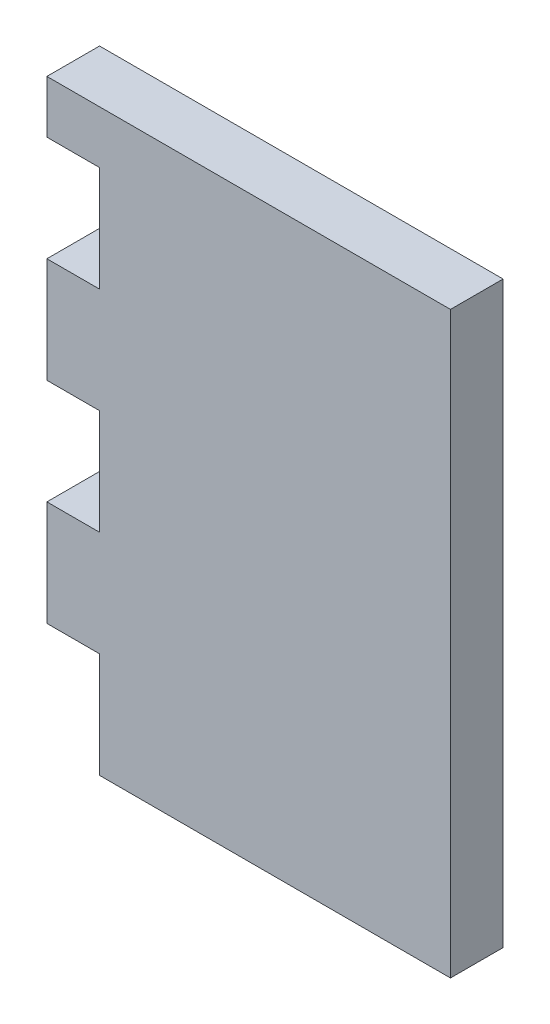
ISO-10303-21;
HEADER;
FILE_DESCRIPTION(('STEP AP214'),'2;1');
FILE_NAME('part.step','',(''),(''),'','','');
FILE_SCHEMA(('AUTOMOTIVE_DESIGN { 1 0 10303 214 1 1 1 1 }'));
ENDSEC;
DATA;
#1=APPLICATION_CONTEXT('core data for automotive mechanical design processes');
#2=APPLICATION_PROTOCOL_DEFINITION('international standard','automotive_design',2000,#1);
#3=PRODUCT_CONTEXT('',#1,'mechanical');
#4=PRODUCT('Part','Part','',(#3));
#5=PRODUCT_RELATED_PRODUCT_CATEGORY('part','',(#4));
#6=PRODUCT_DEFINITION_FORMATION('','',#4);
#7=PRODUCT_DEFINITION_CONTEXT('part definition',#1,'design');
#8=PRODUCT_DEFINITION('design','',#6,#7);
#9=PRODUCT_DEFINITION_SHAPE('','',#8);
#10=(LENGTH_UNIT() NAMED_UNIT(*) SI_UNIT(.MILLI.,.METRE.));
#11=(NAMED_UNIT(*) PLANE_ANGLE_UNIT() SI_UNIT($,.RADIAN.));
#12=(NAMED_UNIT(*) SI_UNIT($,.STERADIAN.) SOLID_ANGLE_UNIT());
#13=UNCERTAINTY_MEASURE_WITH_UNIT(LENGTH_MEASURE(1.E-05),#10,'distance_accuracy_value','');
#14=(GEOMETRIC_REPRESENTATION_CONTEXT(3) GLOBAL_UNCERTAINTY_ASSIGNED_CONTEXT((#13)) GLOBAL_UNIT_ASSIGNED_CONTEXT((#10,
#11,#12)) REPRESENTATION_CONTEXT('',''));
#15=CARTESIAN_POINT('',(0.,0.,0.));
#16=DIRECTION('',(0.,0.,1.));
#17=DIRECTION('',(1.,0.,0.));
#18=AXIS2_PLACEMENT_3D('',#15,#16,#17);
#19=CARTESIAN_POINT('',(0.,0.,6.));
#20=DIRECTION('',(1.,0.,0.));
#21=DIRECTION('',(0.,0.,-1.));
#22=AXIS2_PLACEMENT_3D('',#19,#20,#21);
#23=PLANE('',#22);
#24=DIRECTION('',(0.,-1.,0.));
#25=VECTOR('',#24,1.);
#26=CARTESIAN_POINT('',(0.,0.,0.));
#27=LINE('',#26,#25);
#28=CARTESIAN_POINT('',(0.,0.,0.));
#29=VERTEX_POINT('',#28);
#30=CARTESIAN_POINT('',(0.,-6.00000000000001,0.));
#31=VERTEX_POINT('',#30);
#32=EDGE_CURVE('E179',#29,#31,#27,.T.);
#33=ORIENTED_EDGE('',*,*,#32,.T.);
#34=DIRECTION('',(0.,0.,-1.));
#35=VECTOR('',#34,1.);
#36=CARTESIAN_POINT('',(0.,-6.00000000000001,6.));
#37=LINE('',#36,#35);
#38=CARTESIAN_POINT('',(0.,-6.00000000000001,6.));
#39=VERTEX_POINT('',#38);
#40=EDGE_CURVE('E11',#39,#31,#37,.T.);
#41=ORIENTED_EDGE('',*,*,#40,.F.);
#42=DIRECTION('',(0.,-1.,0.));
#43=VECTOR('',#42,1.);
#44=CARTESIAN_POINT('',(0.,0.,6.));
#45=LINE('',#44,#43);
#46=CARTESIAN_POINT('',(0.,0.,6.));
#47=VERTEX_POINT('',#46);
#48=EDGE_CURVE('E225',#47,#39,#45,.T.);
#49=ORIENTED_EDGE('',*,*,#48,.F.);
#50=DIRECTION('',(0.,0.,-1.));
#51=VECTOR('',#50,1.);
#52=CARTESIAN_POINT('',(0.,0.,6.));
#53=LINE('',#52,#51);
#54=EDGE_CURVE('E59',#47,#29,#53,.T.);
#55=ORIENTED_EDGE('',*,*,#54,.T.);
#56=EDGE_LOOP('',(#33,#41,#49,#55));
#57=FACE_BOUND('',#56,.T.);
#58=ADVANCED_FACE('F41',(#57),#23,.F.);
#59=CARTESIAN_POINT('',(0.,-6.00000000000001,6.));
#60=DIRECTION('',(0.,1.,0.));
#61=DIRECTION('',(0.,0.,1.));
#62=AXIS2_PLACEMENT_3D('',#59,#60,#61);
#63=PLANE('',#62);
#64=DIRECTION('',(1.,0.,0.));
#65=VECTOR('',#64,1.);
#66=CARTESIAN_POINT('',(0.,-6.00000000000001,0.));
#67=LINE('',#66,#65);
#68=CARTESIAN_POINT('',(5.99999999999984,-6.00000000000001,0.));
#69=VERTEX_POINT('',#68);
#70=EDGE_CURVE('E182',#31,#69,#67,.T.);
#71=ORIENTED_EDGE('',*,*,#70,.T.);
#72=DIRECTION('',(0.,0.,-1.));
#73=VECTOR('',#72,1.);
#74=CARTESIAN_POINT('',(5.99999999999984,-6.00000000000001,6.));
#75=LINE('',#74,#73);
#76=CARTESIAN_POINT('',(5.99999999999984,-6.00000000000001,6.));
#77=VERTEX_POINT('',#76);
#78=EDGE_CURVE('E51',#77,#69,#75,.T.);
#79=ORIENTED_EDGE('',*,*,#78,.F.);
#80=DIRECTION('',(1.,0.,0.));
#81=VECTOR('',#80,1.);
#82=CARTESIAN_POINT('',(0.,-6.00000000000001,6.));
#83=LINE('',#82,#81);
#84=EDGE_CURVE('E115',#39,#77,#83,.T.);
#85=ORIENTED_EDGE('',*,*,#84,.F.);
#86=ORIENTED_EDGE('',*,*,#40,.T.);
#87=EDGE_LOOP('',(#71,#79,#85,#86));
#88=FACE_BOUND('',#87,.T.);
#89=ADVANCED_FACE('F43',(#88),#63,.F.);
#90=CARTESIAN_POINT('',(5.99999999999984,0.,6.));
#91=DIRECTION('',(-1.,0.,0.));
#92=DIRECTION('',(0.,-1.,0.));
#93=AXIS2_PLACEMENT_3D('',#90,#91,#92);
#94=PLANE('',#93);
#95=DIRECTION('',(0.,1.,0.));
#96=VECTOR('',#95,1.);
#97=CARTESIAN_POINT('',(5.99999999999984,0.,0.));
#98=LINE('',#97,#96);
#99=CARTESIAN_POINT('',(5.99999999999984,-18.,0.));
#100=VERTEX_POINT('',#99);
#101=EDGE_CURVE('E188',#100,#69,#98,.T.);
#102=ORIENTED_EDGE('',*,*,#101,.F.);
#103=DIRECTION('',(0.,0.,-1.));
#104=VECTOR('',#103,1.);
#105=CARTESIAN_POINT('',(5.99999999999984,-18.,6.));
#106=LINE('',#105,#104);
#107=CARTESIAN_POINT('',(5.99999999999984,-18.,6.));
#108=VERTEX_POINT('',#107);
#109=EDGE_CURVE('E255',#108,#100,#106,.T.);
#110=ORIENTED_EDGE('',*,*,#109,.F.);
#111=DIRECTION('',(0.,1.,0.));
#112=VECTOR('',#111,1.);
#113=CARTESIAN_POINT('',(5.99999999999984,0.,6.));
#114=LINE('',#113,#112);
#115=EDGE_CURVE('E263',#108,#77,#114,.T.);
#116=ORIENTED_EDGE('',*,*,#115,.T.);
#117=ORIENTED_EDGE('',*,*,#78,.T.);
#118=EDGE_LOOP('',(#102,#110,#116,#117));
#119=FACE_BOUND('',#118,.T.);
#120=ADVANCED_FACE('F261',(#119),#94,.T.);
#121=CARTESIAN_POINT('',(0.,-18.,6.));
#122=DIRECTION('',(0.,1.,0.));
#123=DIRECTION('',(0.,0.,1.));
#124=AXIS2_PLACEMENT_3D('',#121,#122,#123);
#125=PLANE('',#124);
#126=DIRECTION('',(1.,0.,0.));
#127=VECTOR('',#126,1.);
#128=CARTESIAN_POINT('',(0.,-18.,0.));
#129=LINE('',#128,#127);
#130=CARTESIAN_POINT('',(0.,-18.,0.));
#131=VERTEX_POINT('',#130);
#132=EDGE_CURVE('E192',#131,#100,#129,.T.);
#133=ORIENTED_EDGE('',*,*,#132,.F.);
#134=DIRECTION('',(0.,0.,-1.));
#135=VECTOR('',#134,1.);
#136=CARTESIAN_POINT('',(0.,-18.,6.));
#137=LINE('',#136,#135);
#138=CARTESIAN_POINT('',(0.,-18.,6.));
#139=VERTEX_POINT('',#138);
#140=EDGE_CURVE('E252',#139,#131,#137,.T.);
#141=ORIENTED_EDGE('',*,*,#140,.F.);
#142=DIRECTION('',(1.,0.,0.));
#143=VECTOR('',#142,1.);
#144=CARTESIAN_POINT('',(0.,-18.,6.));
#145=LINE('',#144,#143);
#146=EDGE_CURVE('E275',#139,#108,#145,.T.);
#147=ORIENTED_EDGE('',*,*,#146,.T.);
#148=ORIENTED_EDGE('',*,*,#109,.T.);
#149=EDGE_LOOP('',(#133,#141,#147,#148));
#150=FACE_BOUND('',#149,.T.);
#151=ADVANCED_FACE('F271',(#150),#125,.T.);
#152=CARTESIAN_POINT('',(0.,-30.,0.));
#153=VERTEX_POINT('',#152);
#154=EDGE_CURVE('E184',#131,#153,#27,.T.);
#155=ORIENTED_EDGE('',*,*,#154,.T.);
#156=DIRECTION('',(0.,0.,-1.));
#157=VECTOR('',#156,1.);
#158=CARTESIAN_POINT('',(0.,-30.,6.));
#159=LINE('',#158,#157);
#160=CARTESIAN_POINT('',(0.,-30.,6.));
#161=VERTEX_POINT('',#160);
#162=EDGE_CURVE('E248',#161,#153,#159,.T.);
#163=ORIENTED_EDGE('',*,*,#162,.F.);
#164=EDGE_CURVE('E280',#139,#161,#45,.T.);
#165=ORIENTED_EDGE('',*,*,#164,.F.);
#166=ORIENTED_EDGE('',*,*,#140,.T.);
#167=EDGE_LOOP('',(#155,#163,#165,#166));
#168=FACE_BOUND('',#167,.T.);
#169=ADVANCED_FACE('F317',(#168),#23,.F.);
#170=CARTESIAN_POINT('',(0.,-30.,6.));
#171=DIRECTION('',(0.,1.,0.));
#172=DIRECTION('',(0.,0.,1.));
#173=AXIS2_PLACEMENT_3D('',#170,#171,#172);
#174=PLANE('',#173);
#175=DIRECTION('',(1.,0.,0.));
#176=VECTOR('',#175,1.);
#177=CARTESIAN_POINT('',(0.,-30.,0.));
#178=LINE('',#177,#176);
#179=CARTESIAN_POINT('',(5.99999999999993,-30.,0.));
#180=VERTEX_POINT('',#179);
#181=EDGE_CURVE('E196',#153,#180,#178,.T.);
#182=ORIENTED_EDGE('',*,*,#181,.T.);
#183=DIRECTION('',(0.,0.,-1.));
#184=VECTOR('',#183,1.);
#185=CARTESIAN_POINT('',(5.99999999999993,-30.,6.));
#186=LINE('',#185,#184);
#187=CARTESIAN_POINT('',(5.99999999999993,-30.,6.));
#188=VERTEX_POINT('',#187);
#189=EDGE_CURVE('E245',#188,#180,#186,.T.);
#190=ORIENTED_EDGE('',*,*,#189,.F.);
#191=DIRECTION('',(1.,0.,0.));
#192=VECTOR('',#191,1.);
#193=CARTESIAN_POINT('',(0.,-30.,6.));
#194=LINE('',#193,#192);
#195=EDGE_CURVE('E285',#161,#188,#194,.T.);
#196=ORIENTED_EDGE('',*,*,#195,.F.);
#197=ORIENTED_EDGE('',*,*,#162,.T.);
#198=EDGE_LOOP('',(#182,#190,#196,#197));
#199=FACE_BOUND('',#198,.T.);
#200=ADVANCED_FACE('F325',(#199),#174,.F.);
#201=CARTESIAN_POINT('',(5.99999999999993,0.,6.));
#202=DIRECTION('',(-1.,0.,0.));
#203=DIRECTION('',(0.,-1.,0.));
#204=AXIS2_PLACEMENT_3D('',#201,#202,#203);
#205=PLANE('',#204);
#206=DIRECTION('',(0.,1.,0.));
#207=VECTOR('',#206,1.);
#208=CARTESIAN_POINT('',(5.99999999999993,0.,0.));
#209=LINE('',#208,#207);
#210=CARTESIAN_POINT('',(5.99999999999992,-42.,0.));
#211=VERTEX_POINT('',#210);
#212=EDGE_CURVE('E200',#211,#180,#209,.T.);
#213=ORIENTED_EDGE('',*,*,#212,.F.);
#214=DIRECTION('',(0.,0.,-1.));
#215=VECTOR('',#214,1.);
#216=CARTESIAN_POINT('',(5.99999999999992,-42.,6.));
#217=LINE('',#216,#215);
#218=CARTESIAN_POINT('',(5.99999999999992,-42.,6.));
#219=VERTEX_POINT('',#218);
#220=EDGE_CURVE('E242',#219,#211,#217,.T.);
#221=ORIENTED_EDGE('',*,*,#220,.F.);
#222=DIRECTION('',(0.,1.,0.));
#223=VECTOR('',#222,1.);
#224=CARTESIAN_POINT('',(5.99999999999993,0.,6.));
#225=LINE('',#224,#223);
#226=EDGE_CURVE('E288',#219,#188,#225,.T.);
#227=ORIENTED_EDGE('',*,*,#226,.T.);
#228=ORIENTED_EDGE('',*,*,#189,.T.);
#229=EDGE_LOOP('',(#213,#221,#227,#228));
#230=FACE_BOUND('',#229,.T.);
#231=ADVANCED_FACE('F336',(#230),#205,.T.);
#232=CARTESIAN_POINT('',(0.,-42.,6.));
#233=DIRECTION('',(0.,1.,0.));
#234=DIRECTION('',(0.,0.,1.));
#235=AXIS2_PLACEMENT_3D('',#232,#233,#234);
#236=PLANE('',#235);
#237=DIRECTION('',(1.,0.,0.));
#238=VECTOR('',#237,1.);
#239=CARTESIAN_POINT('',(0.,-42.,0.));
#240=LINE('',#239,#238);
#241=CARTESIAN_POINT('',(0.,-42.,0.));
#242=VERTEX_POINT('',#241);
#243=EDGE_CURVE('E204',#242,#211,#240,.T.);
#244=ORIENTED_EDGE('',*,*,#243,.F.);
#245=DIRECTION('',(0.,0.,-1.));
#246=VECTOR('',#245,1.);
#247=CARTESIAN_POINT('',(0.,-42.,6.));
#248=LINE('',#247,#246);
#249=CARTESIAN_POINT('',(0.,-42.,6.));
#250=VERTEX_POINT('',#249);
#251=EDGE_CURVE('E239',#250,#242,#248,.T.);
#252=ORIENTED_EDGE('',*,*,#251,.F.);
#253=DIRECTION('',(1.,0.,0.));
#254=VECTOR('',#253,1.);
#255=CARTESIAN_POINT('',(0.,-42.,6.));
#256=LINE('',#255,#254);
#257=EDGE_CURVE('E292',#250,#219,#256,.T.);
#258=ORIENTED_EDGE('',*,*,#257,.T.);
#259=ORIENTED_EDGE('',*,*,#220,.T.);
#260=EDGE_LOOP('',(#244,#252,#258,#259));
#261=FACE_BOUND('',#260,.T.);
#262=ADVANCED_FACE('F329',(#261),#236,.T.);
#263=CARTESIAN_POINT('',(0.,-54.,0.));
#264=VERTEX_POINT('',#263);
#265=EDGE_CURVE('E183',#242,#264,#27,.T.);
#266=ORIENTED_EDGE('',*,*,#265,.T.);
#267=DIRECTION('',(0.,0.,-1.));
#268=VECTOR('',#267,1.);
#269=CARTESIAN_POINT('',(0.,-54.,6.));
#270=LINE('',#269,#268);
#271=CARTESIAN_POINT('',(0.,-54.,6.));
#272=VERTEX_POINT('',#271);
#273=EDGE_CURVE('E235',#272,#264,#270,.T.);
#274=ORIENTED_EDGE('',*,*,#273,.F.);
#275=EDGE_CURVE('E296',#250,#272,#45,.T.);
#276=ORIENTED_EDGE('',*,*,#275,.F.);
#277=ORIENTED_EDGE('',*,*,#251,.T.);
#278=EDGE_LOOP('',(#266,#274,#276,#277));
#279=FACE_BOUND('',#278,.T.);
#280=ADVANCED_FACE('F318',(#279),#23,.F.);
#281=CARTESIAN_POINT('',(0.,-54.,6.));
#282=DIRECTION('',(0.,1.,0.));
#283=DIRECTION('',(0.,0.,1.));
#284=AXIS2_PLACEMENT_3D('',#281,#282,#283);
#285=PLANE('',#284);
#286=DIRECTION('',(1.,0.,0.));
#287=VECTOR('',#286,1.);
#288=CARTESIAN_POINT('',(0.,-54.,0.));
#289=LINE('',#288,#287);
#290=CARTESIAN_POINT('',(6.00000000000001,-54.,0.));
#291=VERTEX_POINT('',#290);
#292=EDGE_CURVE('E208',#264,#291,#289,.T.);
#293=ORIENTED_EDGE('',*,*,#292,.T.);
#294=DIRECTION('',(0.,0.,-1.));
#295=VECTOR('',#294,1.);
#296=CARTESIAN_POINT('',(6.00000000000001,-54.,6.));
#297=LINE('',#296,#295);
#298=CARTESIAN_POINT('',(6.00000000000001,-54.,6.));
#299=VERTEX_POINT('',#298);
#300=EDGE_CURVE('E232',#299,#291,#297,.T.);
#301=ORIENTED_EDGE('',*,*,#300,.F.);
#302=DIRECTION('',(1.,0.,0.));
#303=VECTOR('',#302,1.);
#304=CARTESIAN_POINT('',(0.,-54.,6.));
#305=LINE('',#304,#303);
#306=EDGE_CURVE('E297',#272,#299,#305,.T.);
#307=ORIENTED_EDGE('',*,*,#306,.F.);
#308=ORIENTED_EDGE('',*,*,#273,.T.);
#309=EDGE_LOOP('',(#293,#301,#307,#308));
#310=FACE_BOUND('',#309,.T.);
#311=ADVANCED_FACE('F328',(#310),#285,.F.);
#312=CARTESIAN_POINT('',(6.00000000000002,0.,6.));
#313=DIRECTION('',(-1.,0.,0.));
#314=DIRECTION('',(0.,-1.,0.));
#315=AXIS2_PLACEMENT_3D('',#312,#313,#314);
#316=PLANE('',#315);
#317=DIRECTION('',(0.,1.,0.));
#318=VECTOR('',#317,1.);
#319=CARTESIAN_POINT('',(6.00000000000002,0.,0.));
#320=LINE('',#319,#318);
#321=CARTESIAN_POINT('',(6.00000000000001,-66.,0.));
#322=VERTEX_POINT('',#321);
#323=EDGE_CURVE('E212',#322,#291,#320,.T.);
#324=ORIENTED_EDGE('',*,*,#323,.F.);
#325=DIRECTION('',(0.,0.,-1.));
#326=VECTOR('',#325,1.);
#327=CARTESIAN_POINT('',(6.00000000000001,-66.,6.));
#328=LINE('',#327,#326);
#329=CARTESIAN_POINT('',(6.00000000000001,-66.,6.));
#330=VERTEX_POINT('',#329);
#331=EDGE_CURVE('E169',#330,#322,#328,.T.);
#332=ORIENTED_EDGE('',*,*,#331,.F.);
#333=DIRECTION('',(0.,1.,0.));
#334=VECTOR('',#333,1.);
#335=CARTESIAN_POINT('',(6.00000000000002,0.,6.));
#336=LINE('',#335,#334);
#337=EDGE_CURVE('E157',#330,#299,#336,.T.);
#338=ORIENTED_EDGE('',*,*,#337,.T.);
#339=ORIENTED_EDGE('',*,*,#300,.T.);
#340=EDGE_LOOP('',(#324,#332,#338,#339));
#341=FACE_BOUND('',#340,.T.);
#342=ADVANCED_FACE('F302',(#341),#316,.T.);
#343=CARTESIAN_POINT('',(0.,-66.,6.));
#344=DIRECTION('',(0.,1.,0.));
#345=DIRECTION('',(0.,0.,1.));
#346=AXIS2_PLACEMENT_3D('',#343,#344,#345);
#347=PLANE('',#346);
#348=DIRECTION('',(1.,0.,0.));
#349=VECTOR('',#348,1.);
#350=CARTESIAN_POINT('',(0.,-66.,0.));
#351=LINE('',#350,#349);
#352=CARTESIAN_POINT('',(46.,-66.,0.));
#353=VERTEX_POINT('',#352);
#354=EDGE_CURVE('E165',#322,#353,#351,.T.);
#355=ORIENTED_EDGE('',*,*,#354,.T.);
#356=DIRECTION('',(0.,0.,-1.));
#357=VECTOR('',#356,1.);
#358=CARTESIAN_POINT('',(46.,-66.,6.));
#359=LINE('',#358,#357);
#360=CARTESIAN_POINT('',(46.,-66.,6.));
#361=VERTEX_POINT('',#360);
#362=EDGE_CURVE('E162',#361,#353,#359,.T.);
#363=ORIENTED_EDGE('',*,*,#362,.F.);
#364=DIRECTION('',(1.,0.,0.));
#365=VECTOR('',#364,1.);
#366=CARTESIAN_POINT('',(0.,-66.,6.));
#367=LINE('',#366,#365);
#368=EDGE_CURVE('E150',#330,#361,#367,.T.);
#369=ORIENTED_EDGE('',*,*,#368,.F.);
#370=ORIENTED_EDGE('',*,*,#331,.T.);
#371=EDGE_LOOP('',(#355,#363,#369,#370));
#372=FACE_BOUND('',#371,.T.);
#373=ADVANCED_FACE('F163',(#372),#347,.F.);
#374=CARTESIAN_POINT('',(46.,0.,6.));
#375=DIRECTION('',(1.,0.,0.));
#376=DIRECTION('',(0.,0.,-1.));
#377=AXIS2_PLACEMENT_3D('',#374,#375,#376);
#378=PLANE('',#377);
#379=DIRECTION('',(0.,-1.,0.));
#380=VECTOR('',#379,1.);
#381=CARTESIAN_POINT('',(46.,0.,0.));
#382=LINE('',#381,#380);
#383=CARTESIAN_POINT('',(46.,0.,0.));
#384=VERTEX_POINT('',#383);
#385=EDGE_CURVE('E218',#384,#353,#382,.T.);
#386=ORIENTED_EDGE('',*,*,#385,.F.);
#387=DIRECTION('',(0.,0.,-1.));
#388=VECTOR('',#387,1.);
#389=CARTESIAN_POINT('',(46.,0.,6.));
#390=LINE('',#389,#388);
#391=CARTESIAN_POINT('',(46.,0.,6.));
#392=VERTEX_POINT('',#391);
#393=EDGE_CURVE('E103',#392,#384,#390,.T.);
#394=ORIENTED_EDGE('',*,*,#393,.F.);
#395=DIRECTION('',(0.,-1.,0.));
#396=VECTOR('',#395,1.);
#397=CARTESIAN_POINT('',(46.,0.,6.));
#398=LINE('',#397,#396);
#399=EDGE_CURVE('E155',#392,#361,#398,.T.);
#400=ORIENTED_EDGE('',*,*,#399,.T.);
#401=ORIENTED_EDGE('',*,*,#362,.T.);
#402=EDGE_LOOP('',(#386,#394,#400,#401));
#403=FACE_BOUND('',#402,.T.);
#404=ADVANCED_FACE('F171',(#403),#378,.T.);
#405=CARTESIAN_POINT('',(0.,0.,6.));
#406=DIRECTION('',(0.,1.,0.));
#407=DIRECTION('',(0.,0.,1.));
#408=AXIS2_PLACEMENT_3D('',#405,#406,#407);
#409=PLANE('',#408);
#410=DIRECTION('',(1.,0.,0.));
#411=VECTOR('',#410,1.);
#412=CARTESIAN_POINT('',(0.,0.,0.));
#413=LINE('',#412,#411);
#414=EDGE_CURVE('E221',#29,#384,#413,.T.);
#415=ORIENTED_EDGE('',*,*,#414,.F.);
#416=ORIENTED_EDGE('',*,*,#54,.F.);
#417=DIRECTION('',(1.,0.,0.));
#418=VECTOR('',#417,1.);
#419=CARTESIAN_POINT('',(0.,0.,6.));
#420=LINE('',#419,#418);
#421=EDGE_CURVE('E173',#47,#392,#420,.T.);
#422=ORIENTED_EDGE('',*,*,#421,.T.);
#423=ORIENTED_EDGE('',*,*,#393,.T.);
#424=EDGE_LOOP('',(#415,#416,#422,#423));
#425=FACE_BOUND('',#424,.T.);
#426=ADVANCED_FACE('F305',(#425),#409,.T.);
#427=CARTESIAN_POINT('',(0.,0.,6.));
#428=DIRECTION('',(0.,0.,1.));
#429=DIRECTION('',(1.,0.,0.));
#430=AXIS2_PLACEMENT_3D('',#427,#428,#429);
#431=PLANE('',#430);
#432=ORIENTED_EDGE('',*,*,#48,.T.);
#433=ORIENTED_EDGE('',*,*,#84,.T.);
#434=ORIENTED_EDGE('',*,*,#115,.F.);
#435=ORIENTED_EDGE('',*,*,#146,.F.);
#436=ORIENTED_EDGE('',*,*,#164,.T.);
#437=ORIENTED_EDGE('',*,*,#195,.T.);
#438=ORIENTED_EDGE('',*,*,#226,.F.);
#439=ORIENTED_EDGE('',*,*,#257,.F.);
#440=ORIENTED_EDGE('',*,*,#275,.T.);
#441=ORIENTED_EDGE('',*,*,#306,.T.);
#442=ORIENTED_EDGE('',*,*,#337,.F.);
#443=ORIENTED_EDGE('',*,*,#368,.T.);
#444=ORIENTED_EDGE('',*,*,#399,.F.);
#445=ORIENTED_EDGE('',*,*,#421,.F.);
#446=EDGE_LOOP('',(#432,#433,#434,#435,#436,#437,#438,#439,#440,#441,#442,#443,#444,#445));
#447=FACE_BOUND('',#446,.T.);
#448=ADVANCED_FACE('F152',(#447),#431,.T.);
#449=CARTESIAN_POINT('',(0.,0.,0.));
#450=DIRECTION('',(0.,0.,1.));
#451=DIRECTION('',(1.,0.,0.));
#452=AXIS2_PLACEMENT_3D('',#449,#450,#451);
#453=PLANE('',#452);
#454=ORIENTED_EDGE('',*,*,#32,.F.);
#455=ORIENTED_EDGE('',*,*,#414,.T.);
#456=ORIENTED_EDGE('',*,*,#385,.T.);
#457=ORIENTED_EDGE('',*,*,#354,.F.);
#458=ORIENTED_EDGE('',*,*,#323,.T.);
#459=ORIENTED_EDGE('',*,*,#292,.F.);
#460=ORIENTED_EDGE('',*,*,#265,.F.);
#461=ORIENTED_EDGE('',*,*,#243,.T.);
#462=ORIENTED_EDGE('',*,*,#212,.T.);
#463=ORIENTED_EDGE('',*,*,#181,.F.);
#464=ORIENTED_EDGE('',*,*,#154,.F.);
#465=ORIENTED_EDGE('',*,*,#132,.T.);
#466=ORIENTED_EDGE('',*,*,#101,.T.);
#467=ORIENTED_EDGE('',*,*,#70,.F.);
#468=EDGE_LOOP('',(#454,#455,#456,#457,#458,#459,#460,#461,#462,#463,#464,#465,#466,#467));
#469=FACE_BOUND('',#468,.T.);
#470=ADVANCED_FACE('F266',(#469),#453,.F.);
#471=CLOSED_SHELL('',(#58,#89,#120,#151,#169,#200,#231,#262,#280,#311,#342,#373,#404,#426,#448,#470));
#472=MANIFOLD_SOLID_BREP('B2',#471);
#473=ADVANCED_BREP_SHAPE_REPRESENTATION('',(#18,#472),#14);
#474=SHAPE_DEFINITION_REPRESENTATION(#9,#473);
ENDSEC;
END-ISO-10303-21;
